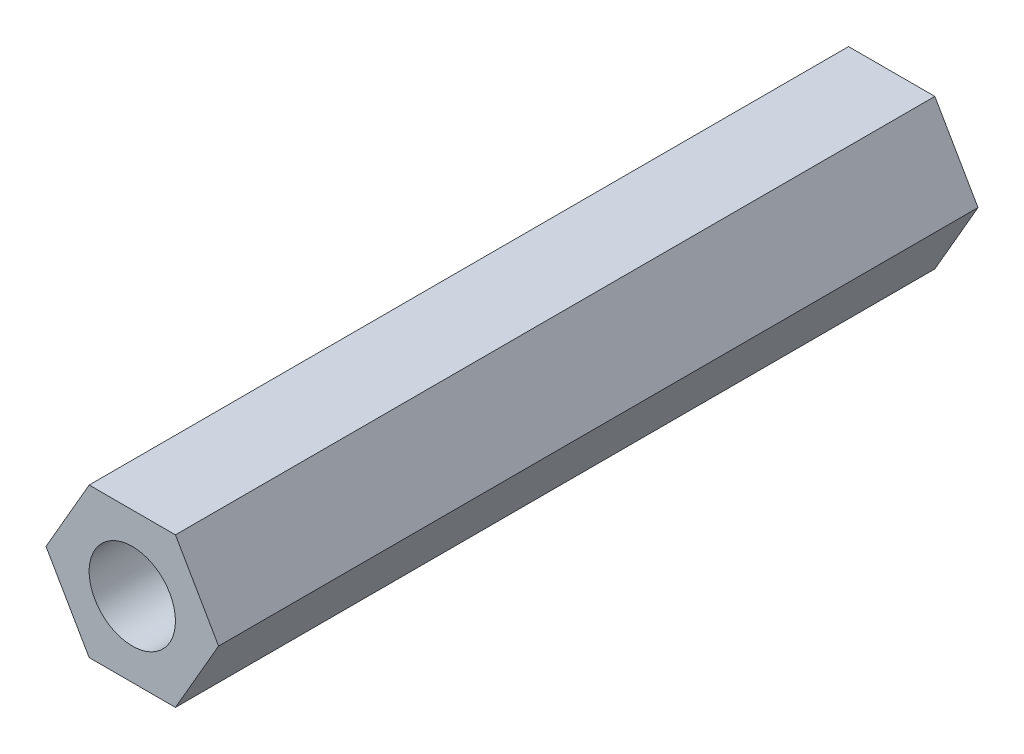
ISO-10303-21;
HEADER;
FILE_DESCRIPTION(('STEP AP214'),'2;1');
FILE_NAME('part.step','',(''),(''),'','','');
FILE_SCHEMA(('AUTOMOTIVE_DESIGN { 1 0 10303 214 1 1 1 1 }'));
ENDSEC;
DATA;
#1=APPLICATION_CONTEXT('core data for automotive mechanical design processes');
#2=APPLICATION_PROTOCOL_DEFINITION('international standard','automotive_design',2000,#1);
#3=PRODUCT_CONTEXT('',#1,'mechanical');
#4=PRODUCT('Part','Part','',(#3));
#5=PRODUCT_RELATED_PRODUCT_CATEGORY('part','',(#4));
#6=PRODUCT_DEFINITION_FORMATION('','',#4);
#7=PRODUCT_DEFINITION_CONTEXT('part definition',#1,'design');
#8=PRODUCT_DEFINITION('design','',#6,#7);
#9=PRODUCT_DEFINITION_SHAPE('','',#8);
#10=(LENGTH_UNIT() NAMED_UNIT(*) SI_UNIT(.MILLI.,.METRE.));
#11=(NAMED_UNIT(*) PLANE_ANGLE_UNIT() SI_UNIT($,.RADIAN.));
#12=(NAMED_UNIT(*) SI_UNIT($,.STERADIAN.) SOLID_ANGLE_UNIT());
#13=UNCERTAINTY_MEASURE_WITH_UNIT(LENGTH_MEASURE(1.E-05),#10,'distance_accuracy_value','');
#14=(GEOMETRIC_REPRESENTATION_CONTEXT(3) GLOBAL_UNCERTAINTY_ASSIGNED_CONTEXT((#13)) GLOBAL_UNIT_ASSIGNED_CONTEXT((#10,
#11,#12)) REPRESENTATION_CONTEXT('',''));
#15=CARTESIAN_POINT('',(0.,0.,0.));
#16=DIRECTION('',(0.,0.,1.));
#17=DIRECTION('',(1.,0.,0.));
#18=AXIS2_PLACEMENT_3D('',#15,#16,#17);
#19=CARTESIAN_POINT('',(-1.25,-2.1650635094611,22.));
#20=DIRECTION('',(0.866025403784439,-0.5,0.));
#21=DIRECTION('',(0.5,0.866025403784439,0.));
#22=AXIS2_PLACEMENT_3D('',#19,#20,#21);
#23=PLANE('',#22);
#24=DIRECTION('',(-0.5,-0.866025403784439,0.));
#25=VECTOR('',#24,1.);
#26=CARTESIAN_POINT('',(-1.25,-2.1650635094611,0.));
#27=LINE('',#26,#25);
#28=CARTESIAN_POINT('',(0.,0.,0.));
#29=VERTEX_POINT('',#28);
#30=CARTESIAN_POINT('',(-1.25,-2.1650635094611,0.));
#31=VERTEX_POINT('',#30);
#32=EDGE_CURVE('E120',#29,#31,#27,.T.);
#33=ORIENTED_EDGE('',*,*,#32,.T.);
#34=DIRECTION('',(0.,0.,-1.));
#35=VECTOR('',#34,1.);
#36=CARTESIAN_POINT('',(-1.25,-2.1650635094611,22.));
#37=LINE('',#36,#35);
#38=CARTESIAN_POINT('',(-1.25,-2.1650635094611,22.));
#39=VERTEX_POINT('',#38);
#40=EDGE_CURVE('E11',#39,#31,#37,.T.);
#41=ORIENTED_EDGE('',*,*,#40,.F.);
#42=DIRECTION('',(-0.5,-0.866025403784439,0.));
#43=VECTOR('',#42,1.);
#44=CARTESIAN_POINT('',(-1.25,-2.1650635094611,22.));
#45=LINE('',#44,#43);
#46=CARTESIAN_POINT('',(0.,0.,22.));
#47=VERTEX_POINT('',#46);
#48=EDGE_CURVE('E131',#47,#39,#45,.T.);
#49=ORIENTED_EDGE('',*,*,#48,.F.);
#50=DIRECTION('',(0.,0.,-1.));
#51=VECTOR('',#50,1.);
#52=CARTESIAN_POINT('',(0.,0.,22.));
#53=LINE('',#52,#51);
#54=EDGE_CURVE('E116',#47,#29,#53,.T.);
#55=ORIENTED_EDGE('',*,*,#54,.T.);
#56=EDGE_LOOP('',(#33,#41,#49,#55));
#57=FACE_BOUND('',#56,.T.);
#58=ADVANCED_FACE('F36',(#57),#23,.F.);
#59=CARTESIAN_POINT('',(0.,-4.33012701892219,22.));
#60=DIRECTION('',(0.866025403784439,0.5,0.));
#61=DIRECTION('',(-0.5,0.866025403784439,0.));
#62=AXIS2_PLACEMENT_3D('',#59,#60,#61);
#63=PLANE('',#62);
#64=DIRECTION('',(0.5,-0.866025403784439,0.));
#65=VECTOR('',#64,1.);
#66=CARTESIAN_POINT('',(0.,-4.33012701892219,0.));
#67=LINE('',#66,#65);
#68=CARTESIAN_POINT('',(0.,-4.33012701892219,0.));
#69=VERTEX_POINT('',#68);
#70=EDGE_CURVE('E123',#31,#69,#67,.T.);
#71=ORIENTED_EDGE('',*,*,#70,.T.);
#72=DIRECTION('',(0.,0.,-1.));
#73=VECTOR('',#72,1.);
#74=CARTESIAN_POINT('',(0.,-4.33012701892219,22.));
#75=LINE('',#74,#73);
#76=CARTESIAN_POINT('',(0.,-4.33012701892219,22.));
#77=VERTEX_POINT('',#76);
#78=EDGE_CURVE('E44',#77,#69,#75,.T.);
#79=ORIENTED_EDGE('',*,*,#78,.F.);
#80=DIRECTION('',(0.5,-0.866025403784439,0.));
#81=VECTOR('',#80,1.);
#82=CARTESIAN_POINT('',(0.,-4.33012701892219,22.));
#83=LINE('',#82,#81);
#84=EDGE_CURVE('E89',#39,#77,#83,.T.);
#85=ORIENTED_EDGE('',*,*,#84,.F.);
#86=ORIENTED_EDGE('',*,*,#40,.T.);
#87=EDGE_LOOP('',(#71,#79,#85,#86));
#88=FACE_BOUND('',#87,.T.);
#89=ADVANCED_FACE('F156',(#88),#63,.F.);
#90=CARTESIAN_POINT('',(2.5,-4.33012701892219,22.));
#91=DIRECTION('',(0.,1.,0.));
#92=DIRECTION('',(0.,0.,1.));
#93=AXIS2_PLACEMENT_3D('',#90,#91,#92);
#94=PLANE('',#93);
#95=DIRECTION('',(1.,0.,0.));
#96=VECTOR('',#95,1.);
#97=CARTESIAN_POINT('',(2.5,-4.33012701892219,0.));
#98=LINE('',#97,#96);
#99=CARTESIAN_POINT('',(2.5,-4.33012701892219,0.));
#100=VERTEX_POINT('',#99);
#101=EDGE_CURVE('E126',#69,#100,#98,.T.);
#102=ORIENTED_EDGE('',*,*,#101,.T.);
#103=DIRECTION('',(0.,0.,-1.));
#104=VECTOR('',#103,1.);
#105=CARTESIAN_POINT('',(2.5,-4.33012701892219,22.));
#106=LINE('',#105,#104);
#107=CARTESIAN_POINT('',(2.5,-4.33012701892219,22.));
#108=VERTEX_POINT('',#107);
#109=EDGE_CURVE('E111',#108,#100,#106,.T.);
#110=ORIENTED_EDGE('',*,*,#109,.F.);
#111=DIRECTION('',(1.,0.,0.));
#112=VECTOR('',#111,1.);
#113=CARTESIAN_POINT('',(2.5,-4.33012701892219,22.));
#114=LINE('',#113,#112);
#115=EDGE_CURVE('E102',#77,#108,#114,.T.);
#116=ORIENTED_EDGE('',*,*,#115,.F.);
#117=ORIENTED_EDGE('',*,*,#78,.T.);
#118=EDGE_LOOP('',(#102,#110,#116,#117));
#119=FACE_BOUND('',#118,.T.);
#120=ADVANCED_FACE('F137',(#119),#94,.F.);
#121=CARTESIAN_POINT('',(3.75,-2.1650635094611,22.));
#122=DIRECTION('',(-0.866025403784439,0.5,0.));
#123=DIRECTION('',(-0.5,-0.866025403784439,0.));
#124=AXIS2_PLACEMENT_3D('',#121,#122,#123);
#125=PLANE('',#124);
#126=DIRECTION('',(0.5,0.866025403784439,0.));
#127=VECTOR('',#126,1.);
#128=CARTESIAN_POINT('',(3.75,-2.1650635094611,0.));
#129=LINE('',#128,#127);
#130=CARTESIAN_POINT('',(3.75,-2.1650635094611,0.));
#131=VERTEX_POINT('',#130);
#132=EDGE_CURVE('E110',#100,#131,#129,.T.);
#133=ORIENTED_EDGE('',*,*,#132,.T.);
#134=DIRECTION('',(0.,0.,-1.));
#135=VECTOR('',#134,1.);
#136=CARTESIAN_POINT('',(3.75,-2.1650635094611,22.));
#137=LINE('',#136,#135);
#138=CARTESIAN_POINT('',(3.75,-2.1650635094611,22.));
#139=VERTEX_POINT('',#138);
#140=EDGE_CURVE('E107',#139,#131,#137,.T.);
#141=ORIENTED_EDGE('',*,*,#140,.F.);
#142=DIRECTION('',(0.5,0.866025403784439,0.));
#143=VECTOR('',#142,1.);
#144=CARTESIAN_POINT('',(3.75,-2.1650635094611,22.));
#145=LINE('',#144,#143);
#146=EDGE_CURVE('E96',#108,#139,#145,.T.);
#147=ORIENTED_EDGE('',*,*,#146,.F.);
#148=ORIENTED_EDGE('',*,*,#109,.T.);
#149=EDGE_LOOP('',(#133,#141,#147,#148));
#150=FACE_BOUND('',#149,.T.);
#151=ADVANCED_FACE('F108',(#150),#125,.F.);
#152=CARTESIAN_POINT('',(2.5,0.,22.));
#153=DIRECTION('',(-0.866025403784439,-0.5,0.));
#154=DIRECTION('',(0.5,-0.866025403784439,0.));
#155=AXIS2_PLACEMENT_3D('',#152,#153,#154);
#156=PLANE('',#155);
#157=DIRECTION('',(-0.5,0.866025403784439,0.));
#158=VECTOR('',#157,1.);
#159=CARTESIAN_POINT('',(2.5,0.,0.));
#160=LINE('',#159,#158);
#161=CARTESIAN_POINT('',(2.5,0.,0.));
#162=VERTEX_POINT('',#161);
#163=EDGE_CURVE('E75',#131,#162,#160,.T.);
#164=ORIENTED_EDGE('',*,*,#163,.T.);
#165=DIRECTION('',(0.,0.,-1.));
#166=VECTOR('',#165,1.);
#167=CARTESIAN_POINT('',(2.5,0.,22.));
#168=LINE('',#167,#166);
#169=CARTESIAN_POINT('',(2.5,0.,22.));
#170=VERTEX_POINT('',#169);
#171=EDGE_CURVE('E112',#170,#162,#168,.T.);
#172=ORIENTED_EDGE('',*,*,#171,.F.);
#173=DIRECTION('',(-0.5,0.866025403784439,0.));
#174=VECTOR('',#173,1.);
#175=CARTESIAN_POINT('',(2.5,0.,22.));
#176=LINE('',#175,#174);
#177=EDGE_CURVE('E100',#139,#170,#176,.T.);
#178=ORIENTED_EDGE('',*,*,#177,.F.);
#179=ORIENTED_EDGE('',*,*,#140,.T.);
#180=EDGE_LOOP('',(#164,#172,#178,#179));
#181=FACE_BOUND('',#180,.T.);
#182=ADVANCED_FACE('F114',(#181),#156,.F.);
#183=CARTESIAN_POINT('',(0.,0.,22.));
#184=DIRECTION('',(0.,-1.,0.));
#185=DIRECTION('',(0.,0.,-1.));
#186=AXIS2_PLACEMENT_3D('',#183,#184,#185);
#187=PLANE('',#186);
#188=DIRECTION('',(-1.,0.,0.));
#189=VECTOR('',#188,1.);
#190=CARTESIAN_POINT('',(0.,0.,0.));
#191=LINE('',#190,#189);
#192=EDGE_CURVE('E81',#162,#29,#191,.T.);
#193=ORIENTED_EDGE('',*,*,#192,.T.);
#194=ORIENTED_EDGE('',*,*,#54,.F.);
#195=DIRECTION('',(-1.,0.,0.));
#196=VECTOR('',#195,1.);
#197=CARTESIAN_POINT('',(0.,0.,22.));
#198=LINE('',#197,#196);
#199=EDGE_CURVE('E52',#170,#47,#198,.T.);
#200=ORIENTED_EDGE('',*,*,#199,.F.);
#201=ORIENTED_EDGE('',*,*,#171,.T.);
#202=EDGE_LOOP('',(#193,#194,#200,#201));
#203=FACE_BOUND('',#202,.T.);
#204=ADVANCED_FACE('F144',(#203),#187,.F.);
#205=CARTESIAN_POINT('',(0.,0.,22.));
#206=DIRECTION('',(0.,0.,-1.));
#207=DIRECTION('',(-1.,0.,0.));
#208=AXIS2_PLACEMENT_3D('',#205,#206,#207);
#209=PLANE('',#208);
#210=CARTESIAN_POINT('',(1.25,-2.1650635094611,22.));
#211=DIRECTION('',(0.,0.,1.));
#212=DIRECTION('',(1.,0.,0.));
#213=AXIS2_PLACEMENT_3D('',#210,#211,#212);
#214=CIRCLE('',#213,1.24999999999999);
#215=CARTESIAN_POINT('',(2.49999999999999,-2.1650635094611,22.));
#216=VERTEX_POINT('',#215);
#217=EDGE_CURVE('E213',#216,#216,#214,.T.);
#218=ORIENTED_EDGE('',*,*,#217,.F.);
#219=EDGE_LOOP('',(#218));
#220=FACE_BOUND('',#219,.T.);
#221=ORIENTED_EDGE('',*,*,#48,.T.);
#222=ORIENTED_EDGE('',*,*,#84,.T.);
#223=ORIENTED_EDGE('',*,*,#115,.T.);
#224=ORIENTED_EDGE('',*,*,#146,.T.);
#225=ORIENTED_EDGE('',*,*,#177,.T.);
#226=ORIENTED_EDGE('',*,*,#199,.T.);
#227=EDGE_LOOP('',(#221,#222,#223,#224,#225,#226));
#228=FACE_BOUND('',#227,.T.);
#229=ADVANCED_FACE('F98',(#220,#228),#209,.F.);
#230=CARTESIAN_POINT('',(0.,0.,0.));
#231=DIRECTION('',(0.,0.,-1.));
#232=DIRECTION('',(-1.,0.,0.));
#233=AXIS2_PLACEMENT_3D('',#230,#231,#232);
#234=PLANE('',#233);
#235=CARTESIAN_POINT('',(1.25,-2.1650635094611,0.));
#236=DIRECTION('',(0.,0.,1.));
#237=DIRECTION('',(1.,0.,0.));
#238=AXIS2_PLACEMENT_3D('',#235,#236,#237);
#239=CIRCLE('',#238,1.24999999999999);
#240=CARTESIAN_POINT('',(2.49999999999999,-2.1650635094611,0.));
#241=VERTEX_POINT('',#240);
#242=EDGE_CURVE('E124',#241,#241,#239,.T.);
#243=ORIENTED_EDGE('',*,*,#242,.T.);
#244=EDGE_LOOP('',(#243));
#245=FACE_BOUND('',#244,.T.);
#246=ORIENTED_EDGE('',*,*,#32,.F.);
#247=ORIENTED_EDGE('',*,*,#192,.F.);
#248=ORIENTED_EDGE('',*,*,#163,.F.);
#249=ORIENTED_EDGE('',*,*,#132,.F.);
#250=ORIENTED_EDGE('',*,*,#101,.F.);
#251=ORIENTED_EDGE('',*,*,#70,.F.);
#252=EDGE_LOOP('',(#246,#247,#248,#249,#250,#251));
#253=FACE_BOUND('',#252,.T.);
#254=ADVANCED_FACE('F140',(#245,#253),#234,.T.);
#255=CARTESIAN_POINT('',(1.25,-2.1650635094611,22.));
#256=DIRECTION('',(0.,0.,1.));
#257=DIRECTION('',(1.,0.,0.));
#258=AXIS2_PLACEMENT_3D('',#255,#256,#257);
#259=CYLINDRICAL_SURFACE('',#258,1.24999999999999);
#260=ORIENTED_EDGE('',*,*,#242,.F.);
#261=EDGE_LOOP('',(#260));
#262=FACE_BOUND('',#261,.T.);
#263=ORIENTED_EDGE('',*,*,#217,.T.);
#264=EDGE_LOOP('',(#263));
#265=FACE_BOUND('',#264,.T.);
#266=ADVANCED_FACE('F193',(#262,#265),#259,.F.);
#267=CLOSED_SHELL('',(#58,#89,#120,#151,#182,#204,#229,#254,#266));
#268=MANIFOLD_SOLID_BREP('B2',#267);
#269=ADVANCED_BREP_SHAPE_REPRESENTATION('',(#18,#268),#14);
#270=SHAPE_DEFINITION_REPRESENTATION(#9,#269);
ENDSEC;
END-ISO-10303-21;
